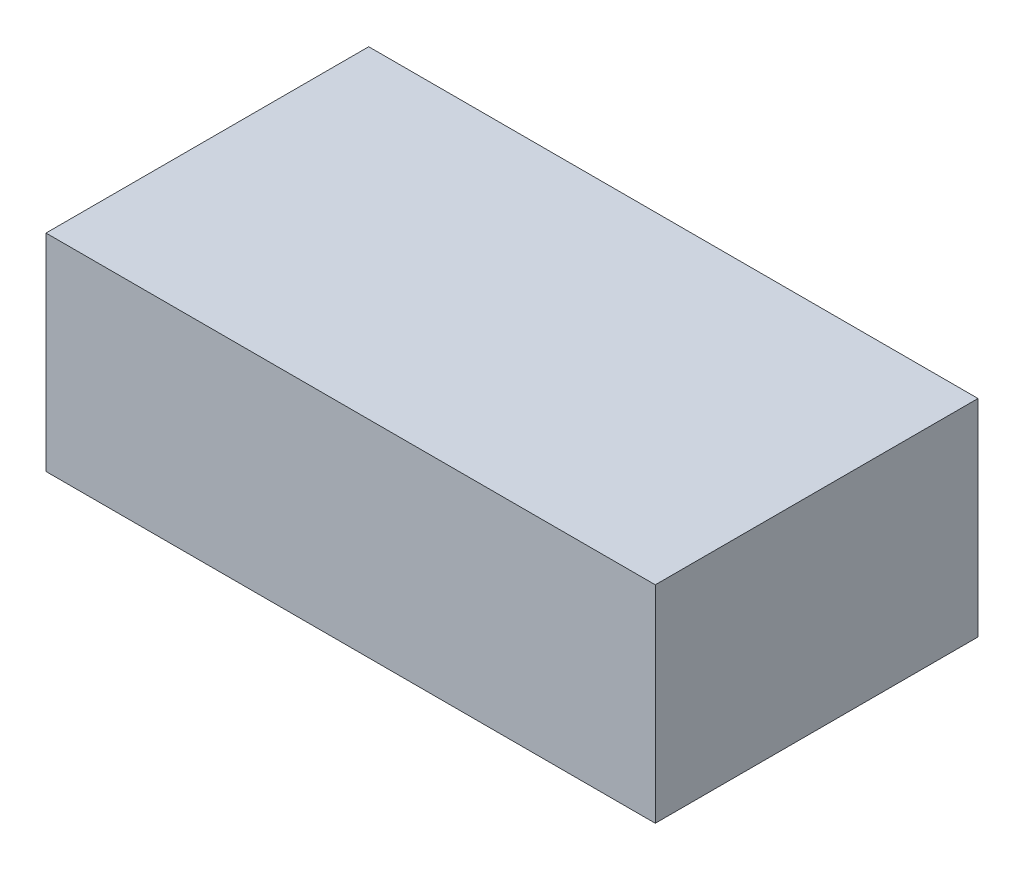
ISO-10303-21;
HEADER;
FILE_DESCRIPTION(('STEP AP214'),'2;1');
FILE_NAME('part.step','',(''),(''),'','','');
FILE_SCHEMA(('AUTOMOTIVE_DESIGN { 1 0 10303 214 1 1 1 1 }'));
ENDSEC;
DATA;
#1=APPLICATION_CONTEXT('core data for automotive mechanical design processes');
#2=APPLICATION_PROTOCOL_DEFINITION('international standard','automotive_design',2000,#1);
#3=PRODUCT_CONTEXT('',#1,'mechanical');
#4=PRODUCT('Part','Part','',(#3));
#5=PRODUCT_RELATED_PRODUCT_CATEGORY('part','',(#4));
#6=PRODUCT_DEFINITION_FORMATION('','',#4);
#7=PRODUCT_DEFINITION_CONTEXT('part definition',#1,'design');
#8=PRODUCT_DEFINITION('design','',#6,#7);
#9=PRODUCT_DEFINITION_SHAPE('','',#8);
#10=(LENGTH_UNIT() NAMED_UNIT(*) SI_UNIT(.MILLI.,.METRE.));
#11=(NAMED_UNIT(*) PLANE_ANGLE_UNIT() SI_UNIT($,.RADIAN.));
#12=(NAMED_UNIT(*) SI_UNIT($,.STERADIAN.) SOLID_ANGLE_UNIT());
#13=UNCERTAINTY_MEASURE_WITH_UNIT(LENGTH_MEASURE(1.E-05),#10,'distance_accuracy_value','');
#14=(GEOMETRIC_REPRESENTATION_CONTEXT(3) GLOBAL_UNCERTAINTY_ASSIGNED_CONTEXT((#13)) GLOBAL_UNIT_ASSIGNED_CONTEXT((#10,
#11,#12)) REPRESENTATION_CONTEXT('',''));
#15=CARTESIAN_POINT('',(0.,0.,0.));
#16=DIRECTION('',(0.,0.,1.));
#17=DIRECTION('',(1.,0.,0.));
#18=AXIS2_PLACEMENT_3D('',#15,#16,#17);
#19=CARTESIAN_POINT('',(-1.4986,1.016,-0.79375));
#20=DIRECTION('',(1.,0.,0.));
#21=DIRECTION('',(0.,0.,-1.));
#22=AXIS2_PLACEMENT_3D('',#19,#20,#21);
#23=PLANE('',#22);
#24=DIRECTION('',(0.,0.,1.));
#25=VECTOR('',#24,1.);
#26=CARTESIAN_POINT('',(-1.4986,0.,-0.79375));
#27=LINE('',#26,#25);
#28=CARTESIAN_POINT('',(-1.4986,0.,-0.79375));
#29=VERTEX_POINT('',#28);
#30=CARTESIAN_POINT('',(-1.4986,0.,0.79375));
#31=VERTEX_POINT('',#30);
#32=EDGE_CURVE('E102',#29,#31,#27,.T.);
#33=ORIENTED_EDGE('',*,*,#32,.T.);
#34=DIRECTION('',(0.,-1.,0.));
#35=VECTOR('',#34,1.);
#36=CARTESIAN_POINT('',(-1.4986,1.016,0.79375));
#37=LINE('',#36,#35);
#38=CARTESIAN_POINT('',(-1.4986,1.016,0.79375));
#39=VERTEX_POINT('',#38);
#40=EDGE_CURVE('E11',#39,#31,#37,.T.);
#41=ORIENTED_EDGE('',*,*,#40,.F.);
#42=DIRECTION('',(0.,0.,1.));
#43=VECTOR('',#42,1.);
#44=CARTESIAN_POINT('',(-1.4986,1.016,-0.79375));
#45=LINE('',#44,#43);
#46=CARTESIAN_POINT('',(-1.4986,1.016,-0.79375));
#47=VERTEX_POINT('',#46);
#48=EDGE_CURVE('E90',#47,#39,#45,.T.);
#49=ORIENTED_EDGE('',*,*,#48,.F.);
#50=DIRECTION('',(0.,-1.,0.));
#51=VECTOR('',#50,1.);
#52=CARTESIAN_POINT('',(-1.4986,1.016,-0.79375));
#53=LINE('',#52,#51);
#54=EDGE_CURVE('E98',#47,#29,#53,.T.);
#55=ORIENTED_EDGE('',*,*,#54,.T.);
#56=EDGE_LOOP('',(#33,#41,#49,#55));
#57=FACE_BOUND('',#56,.T.);
#58=ADVANCED_FACE('F39',(#57),#23,.F.);
#59=CARTESIAN_POINT('',(-1.4986,1.016,0.79375));
#60=DIRECTION('',(0.,0.,-1.));
#61=DIRECTION('',(-1.,0.,0.));
#62=AXIS2_PLACEMENT_3D('',#59,#60,#61);
#63=PLANE('',#62);
#64=DIRECTION('',(1.,0.,0.));
#65=VECTOR('',#64,1.);
#66=CARTESIAN_POINT('',(-1.4986,0.,0.79375));
#67=LINE('',#66,#65);
#68=CARTESIAN_POINT('',(1.4986,0.,0.79375));
#69=VERTEX_POINT('',#68);
#70=EDGE_CURVE('E94',#31,#69,#67,.T.);
#71=ORIENTED_EDGE('',*,*,#70,.T.);
#72=DIRECTION('',(0.,-1.,0.));
#73=VECTOR('',#72,1.);
#74=CARTESIAN_POINT('',(1.4986,1.016,0.79375));
#75=LINE('',#74,#73);
#76=CARTESIAN_POINT('',(1.4986,1.016,0.79375));
#77=VERTEX_POINT('',#76);
#78=EDGE_CURVE('E47',#77,#69,#75,.T.);
#79=ORIENTED_EDGE('',*,*,#78,.F.);
#80=DIRECTION('',(1.,0.,0.));
#81=VECTOR('',#80,1.);
#82=CARTESIAN_POINT('',(-1.4986,1.016,0.79375));
#83=LINE('',#82,#81);
#84=EDGE_CURVE('E85',#39,#77,#83,.T.);
#85=ORIENTED_EDGE('',*,*,#84,.F.);
#86=ORIENTED_EDGE('',*,*,#40,.T.);
#87=EDGE_LOOP('',(#71,#79,#85,#86));
#88=FACE_BOUND('',#87,.T.);
#89=ADVANCED_FACE('F93',(#88),#63,.F.);
#90=CARTESIAN_POINT('',(1.4986,1.016,-0.79375));
#91=DIRECTION('',(-1.,0.,0.));
#92=DIRECTION('',(0.,0.,1.));
#93=AXIS2_PLACEMENT_3D('',#90,#91,#92);
#94=PLANE('',#93);
#95=DIRECTION('',(0.,0.,-1.));
#96=VECTOR('',#95,1.);
#97=CARTESIAN_POINT('',(1.4986,0.,-0.79375));
#98=LINE('',#97,#96);
#99=CARTESIAN_POINT('',(1.4986,0.,-0.79375));
#100=VERTEX_POINT('',#99);
#101=EDGE_CURVE('E72',#69,#100,#98,.T.);
#102=ORIENTED_EDGE('',*,*,#101,.T.);
#103=DIRECTION('',(0.,-1.,0.));
#104=VECTOR('',#103,1.);
#105=CARTESIAN_POINT('',(1.4986,1.016,-0.79375));
#106=LINE('',#105,#104);
#107=CARTESIAN_POINT('',(1.4986,1.016,-0.79375));
#108=VERTEX_POINT('',#107);
#109=EDGE_CURVE('E95',#108,#100,#106,.T.);
#110=ORIENTED_EDGE('',*,*,#109,.F.);
#111=DIRECTION('',(0.,0.,-1.));
#112=VECTOR('',#111,1.);
#113=CARTESIAN_POINT('',(1.4986,1.016,-0.79375));
#114=LINE('',#113,#112);
#115=EDGE_CURVE('E88',#77,#108,#114,.T.);
#116=ORIENTED_EDGE('',*,*,#115,.F.);
#117=ORIENTED_EDGE('',*,*,#78,.T.);
#118=EDGE_LOOP('',(#102,#110,#116,#117));
#119=FACE_BOUND('',#118,.T.);
#120=ADVANCED_FACE('F96',(#119),#94,.F.);
#121=CARTESIAN_POINT('',(-1.4986,1.016,-0.79375));
#122=DIRECTION('',(0.,0.,1.));
#123=DIRECTION('',(1.,0.,0.));
#124=AXIS2_PLACEMENT_3D('',#121,#122,#123);
#125=PLANE('',#124);
#126=DIRECTION('',(-1.,0.,0.));
#127=VECTOR('',#126,1.);
#128=CARTESIAN_POINT('',(-1.4986,0.,-0.79375));
#129=LINE('',#128,#127);
#130=EDGE_CURVE('E78',#100,#29,#129,.T.);
#131=ORIENTED_EDGE('',*,*,#130,.T.);
#132=ORIENTED_EDGE('',*,*,#54,.F.);
#133=DIRECTION('',(-1.,0.,0.));
#134=VECTOR('',#133,1.);
#135=CARTESIAN_POINT('',(-1.4986,1.016,-0.79375));
#136=LINE('',#135,#134);
#137=EDGE_CURVE('E55',#108,#47,#136,.T.);
#138=ORIENTED_EDGE('',*,*,#137,.F.);
#139=ORIENTED_EDGE('',*,*,#109,.T.);
#140=EDGE_LOOP('',(#131,#132,#138,#139));
#141=FACE_BOUND('',#140,.T.);
#142=ADVANCED_FACE('F109',(#141),#125,.F.);
#143=CARTESIAN_POINT('',(0.,1.016,0.));
#144=DIRECTION('',(0.,1.,0.));
#145=DIRECTION('',(0.,0.,1.));
#146=AXIS2_PLACEMENT_3D('',#143,#144,#145);
#147=PLANE('',#146);
#148=ORIENTED_EDGE('',*,*,#48,.T.);
#149=ORIENTED_EDGE('',*,*,#84,.T.);
#150=ORIENTED_EDGE('',*,*,#115,.T.);
#151=ORIENTED_EDGE('',*,*,#137,.T.);
#152=EDGE_LOOP('',(#148,#149,#150,#151));
#153=FACE_BOUND('',#152,.T.);
#154=ADVANCED_FACE('F86',(#153),#147,.T.);
#155=CARTESIAN_POINT('',(0.,0.,0.));
#156=DIRECTION('',(0.,1.,0.));
#157=DIRECTION('',(0.,0.,1.));
#158=AXIS2_PLACEMENT_3D('',#155,#156,#157);
#159=PLANE('',#158);
#160=ORIENTED_EDGE('',*,*,#32,.F.);
#161=ORIENTED_EDGE('',*,*,#130,.F.);
#162=ORIENTED_EDGE('',*,*,#101,.F.);
#163=ORIENTED_EDGE('',*,*,#70,.F.);
#164=EDGE_LOOP('',(#160,#161,#162,#163));
#165=FACE_BOUND('',#164,.T.);
#166=ADVANCED_FACE('F112',(#165),#159,.F.);
#167=CLOSED_SHELL('',(#58,#89,#120,#142,#154,#166));
#168=MANIFOLD_SOLID_BREP('B2',#167);
#169=ADVANCED_BREP_SHAPE_REPRESENTATION('',(#18,#168),#14);
#170=SHAPE_DEFINITION_REPRESENTATION(#9,#169);
ENDSEC;
END-ISO-10303-21;
